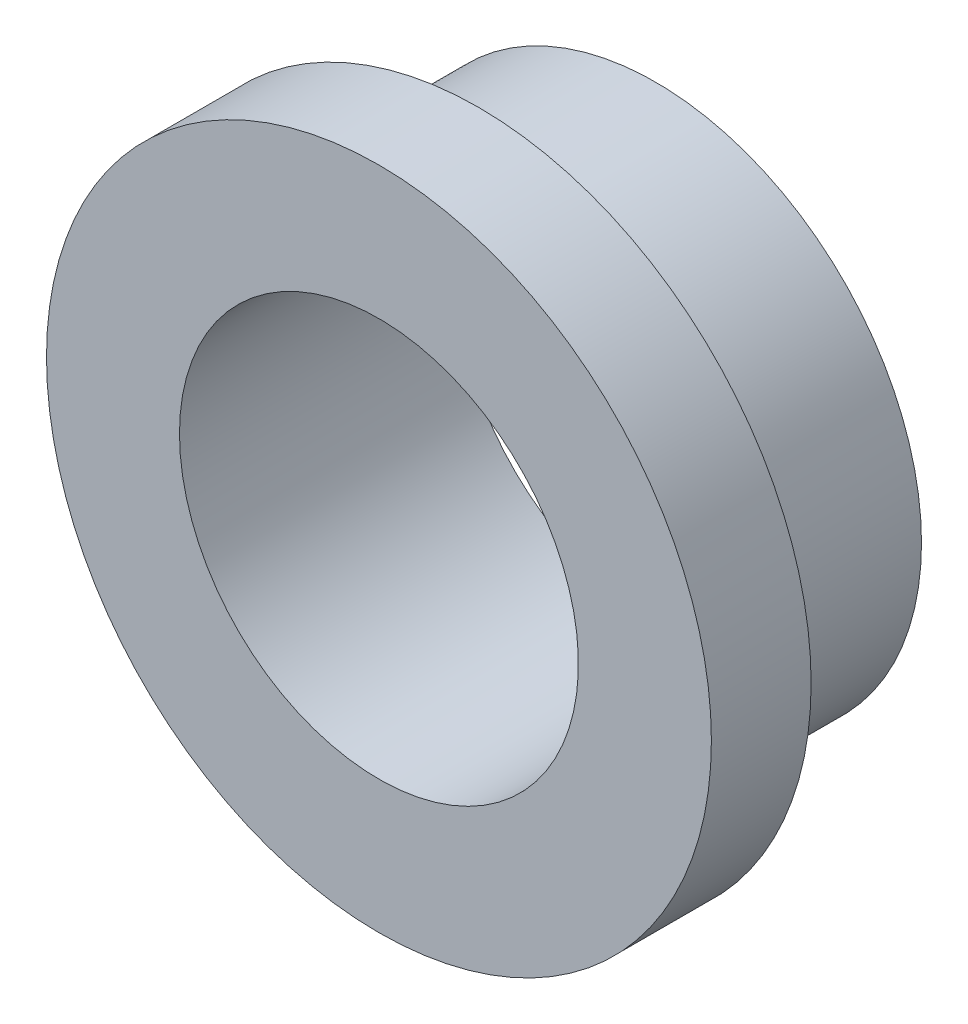
ISO-10303-21;
HEADER;
FILE_DESCRIPTION(('STEP AP214'),'2;1');
FILE_NAME('part.step','',(''),(''),'','','');
FILE_SCHEMA(('AUTOMOTIVE_DESIGN { 1 0 10303 214 1 1 1 1 }'));
ENDSEC;
DATA;
#1=APPLICATION_CONTEXT('core data for automotive mechanical design processes');
#2=APPLICATION_PROTOCOL_DEFINITION('international standard','automotive_design',2000,#1);
#3=PRODUCT_CONTEXT('',#1,'mechanical');
#4=PRODUCT('Part','Part','',(#3));
#5=PRODUCT_RELATED_PRODUCT_CATEGORY('part','',(#4));
#6=PRODUCT_DEFINITION_FORMATION('','',#4);
#7=PRODUCT_DEFINITION_CONTEXT('part definition',#1,'design');
#8=PRODUCT_DEFINITION('design','',#6,#7);
#9=PRODUCT_DEFINITION_SHAPE('','',#8);
#10=(LENGTH_UNIT() NAMED_UNIT(*) SI_UNIT(.MILLI.,.METRE.));
#11=(NAMED_UNIT(*) PLANE_ANGLE_UNIT() SI_UNIT($,.RADIAN.));
#12=(NAMED_UNIT(*) SI_UNIT($,.STERADIAN.) SOLID_ANGLE_UNIT());
#13=UNCERTAINTY_MEASURE_WITH_UNIT(LENGTH_MEASURE(1.E-05),#10,'distance_accuracy_value','');
#14=(GEOMETRIC_REPRESENTATION_CONTEXT(3) GLOBAL_UNCERTAINTY_ASSIGNED_CONTEXT((#13)) GLOBAL_UNIT_ASSIGNED_CONTEXT((#10,
#11,#12)) REPRESENTATION_CONTEXT('',''));
#15=CARTESIAN_POINT('',(0.,0.,0.));
#16=DIRECTION('',(0.,0.,1.));
#17=DIRECTION('',(1.,0.,0.));
#18=AXIS2_PLACEMENT_3D('',#15,#16,#17);
#19=CARTESIAN_POINT('',(0.,15.875,0.));
#20=DIRECTION('',(0.,0.,1.));
#21=DIRECTION('',(1.,0.,0.));
#22=AXIS2_PLACEMENT_3D('',#19,#20,#21);
#23=PLANE('',#22);
#24=CARTESIAN_POINT('',(0.,0.,0.));
#25=DIRECTION('',(0.,0.,-1.));
#26=DIRECTION('',(-1.,0.,0.));
#27=AXIS2_PLACEMENT_3D('',#24,#25,#26);
#28=CIRCLE('',#27,9.525);
#29=CARTESIAN_POINT('',(-9.525,0.,0.));
#30=VERTEX_POINT('',#29);
#31=EDGE_CURVE('E10',#30,#30,#28,.T.);
#32=ORIENTED_EDGE('',*,*,#31,.T.);
#33=EDGE_LOOP('',(#32));
#34=FACE_BOUND('',#33,.T.);
#35=CARTESIAN_POINT('',(0.,0.,0.));
#36=DIRECTION('',(0.,0.,-1.));
#37=DIRECTION('',(-1.,0.,0.));
#38=AXIS2_PLACEMENT_3D('',#35,#36,#37);
#39=CIRCLE('',#38,15.875);
#40=CARTESIAN_POINT('',(-15.875,0.,0.));
#41=VERTEX_POINT('',#40);
#42=EDGE_CURVE('E52',#41,#41,#39,.T.);
#43=ORIENTED_EDGE('',*,*,#42,.F.);
#44=EDGE_LOOP('',(#43));
#45=FACE_BOUND('',#44,.T.);
#46=ADVANCED_FACE('F30',(#34,#45),#23,.T.);
#47=CARTESIAN_POINT('',(0.,0.,0.));
#48=DIRECTION('',(0.,0.,-1.));
#49=DIRECTION('',(-1.,0.,0.));
#50=AXIS2_PLACEMENT_3D('',#47,#48,#49);
#51=CYLINDRICAL_SURFACE('',#50,9.525);
#52=CARTESIAN_POINT('',(0.,0.,-13.208));
#53=DIRECTION('',(0.,0.,-1.));
#54=DIRECTION('',(-1.,0.,0.));
#55=AXIS2_PLACEMENT_3D('',#52,#53,#54);
#56=CIRCLE('',#55,9.525);
#57=CARTESIAN_POINT('',(-9.525,0.,-13.208));
#58=VERTEX_POINT('',#57);
#59=EDGE_CURVE('E36',#58,#58,#56,.T.);
#60=ORIENTED_EDGE('',*,*,#59,.T.);
#61=EDGE_LOOP('',(#60));
#62=FACE_BOUND('',#61,.T.);
#63=ORIENTED_EDGE('',*,*,#31,.F.);
#64=EDGE_LOOP('',(#63));
#65=FACE_BOUND('',#64,.T.);
#66=ADVANCED_FACE('F60',(#62,#65),#51,.F.);
#67=CARTESIAN_POINT('',(0.,12.7,-13.208));
#68=DIRECTION('',(0.,0.,-1.));
#69=DIRECTION('',(-1.,0.,0.));
#70=AXIS2_PLACEMENT_3D('',#67,#68,#69);
#71=PLANE('',#70);
#72=CARTESIAN_POINT('',(0.,0.,-13.208));
#73=DIRECTION('',(0.,0.,-1.));
#74=DIRECTION('',(-1.,0.,0.));
#75=AXIS2_PLACEMENT_3D('',#72,#73,#74);
#76=CIRCLE('',#75,12.7);
#77=CARTESIAN_POINT('',(-12.7,0.,-13.208));
#78=VERTEX_POINT('',#77);
#79=EDGE_CURVE('E40',#78,#78,#76,.T.);
#80=ORIENTED_EDGE('',*,*,#79,.T.);
#81=EDGE_LOOP('',(#80));
#82=FACE_BOUND('',#81,.T.);
#83=ORIENTED_EDGE('',*,*,#59,.F.);
#84=EDGE_LOOP('',(#83));
#85=FACE_BOUND('',#84,.T.);
#86=ADVANCED_FACE('F64',(#82,#85),#71,.T.);
#87=CARTESIAN_POINT('',(0.,0.,0.));
#88=DIRECTION('',(0.,0.,-1.));
#89=DIRECTION('',(-1.,0.,0.));
#90=AXIS2_PLACEMENT_3D('',#87,#88,#89);
#91=CYLINDRICAL_SURFACE('',#90,12.7);
#92=CARTESIAN_POINT('',(0.,0.,-4.7625));
#93=DIRECTION('',(0.,0.,-1.));
#94=DIRECTION('',(-1.,0.,0.));
#95=AXIS2_PLACEMENT_3D('',#92,#93,#94);
#96=CIRCLE('',#95,12.7);
#97=CARTESIAN_POINT('',(-12.7,0.,-4.7625));
#98=VERTEX_POINT('',#97);
#99=EDGE_CURVE('E44',#98,#98,#96,.T.);
#100=ORIENTED_EDGE('',*,*,#99,.T.);
#101=EDGE_LOOP('',(#100));
#102=FACE_BOUND('',#101,.T.);
#103=ORIENTED_EDGE('',*,*,#79,.F.);
#104=EDGE_LOOP('',(#103));
#105=FACE_BOUND('',#104,.T.);
#106=ADVANCED_FACE('F68',(#102,#105),#91,.T.);
#107=CARTESIAN_POINT('',(0.,15.875,-4.7625));
#108=DIRECTION('',(0.,0.,-1.));
#109=DIRECTION('',(-1.,0.,0.));
#110=AXIS2_PLACEMENT_3D('',#107,#108,#109);
#111=PLANE('',#110);
#112=CARTESIAN_POINT('',(0.,0.,-4.7625));
#113=DIRECTION('',(0.,0.,-1.));
#114=DIRECTION('',(-1.,0.,0.));
#115=AXIS2_PLACEMENT_3D('',#112,#113,#114);
#116=CIRCLE('',#115,15.875);
#117=CARTESIAN_POINT('',(-15.875,0.,-4.7625));
#118=VERTEX_POINT('',#117);
#119=EDGE_CURVE('E49',#118,#118,#116,.T.);
#120=ORIENTED_EDGE('',*,*,#119,.T.);
#121=EDGE_LOOP('',(#120));
#122=FACE_BOUND('',#121,.T.);
#123=ORIENTED_EDGE('',*,*,#99,.F.);
#124=EDGE_LOOP('',(#123));
#125=FACE_BOUND('',#124,.T.);
#126=ADVANCED_FACE('F75',(#122,#125),#111,.T.);
#127=CARTESIAN_POINT('',(0.,0.,0.));
#128=DIRECTION('',(0.,0.,-1.));
#129=DIRECTION('',(-1.,0.,0.));
#130=AXIS2_PLACEMENT_3D('',#127,#128,#129);
#131=CYLINDRICAL_SURFACE('',#130,15.875);
#132=ORIENTED_EDGE('',*,*,#42,.T.);
#133=EDGE_LOOP('',(#132));
#134=FACE_BOUND('',#133,.T.);
#135=ORIENTED_EDGE('',*,*,#119,.F.);
#136=EDGE_LOOP('',(#135));
#137=FACE_BOUND('',#136,.T.);
#138=ADVANCED_FACE('F56',(#134,#137),#131,.T.);
#139=CLOSED_SHELL('',(#46,#66,#86,#106,#126,#138));
#140=MANIFOLD_SOLID_BREP('B2',#139);
#141=ADVANCED_BREP_SHAPE_REPRESENTATION('',(#18,#140),#14);
#142=SHAPE_DEFINITION_REPRESENTATION(#9,#141);
ENDSEC;
END-ISO-10303-21;
